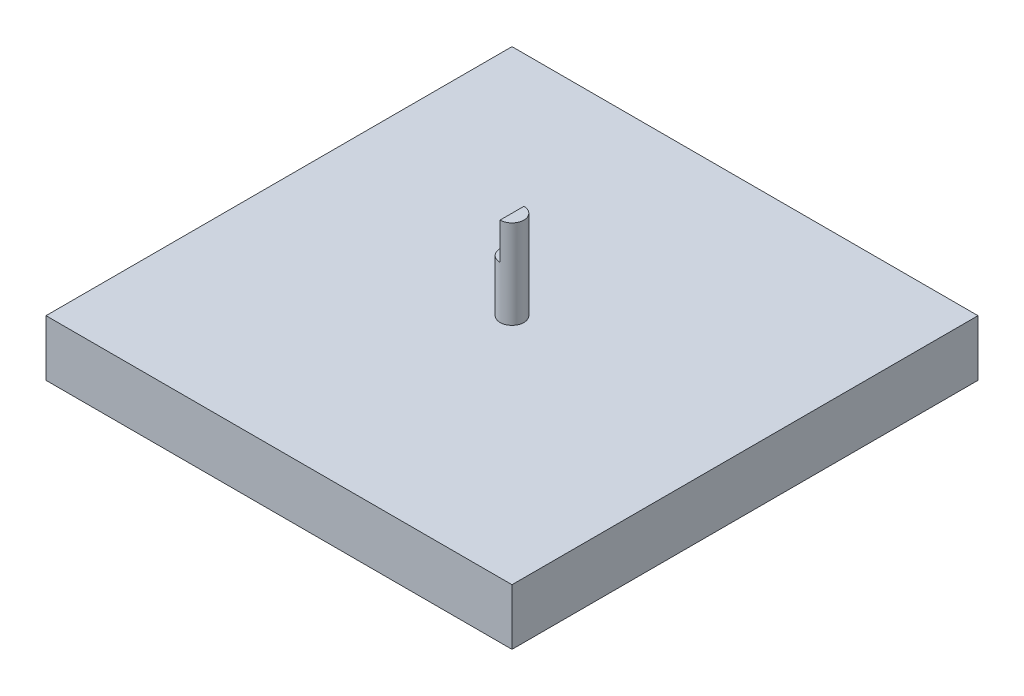
ISO-10303-21;
HEADER;
FILE_DESCRIPTION(('STEP AP214'),'2;1');
FILE_NAME('part.step','',(''),(''),'','','');
FILE_SCHEMA(('AUTOMOTIVE_DESIGN { 1 0 10303 214 1 1 1 1 }'));
ENDSEC;
DATA;
#1=APPLICATION_CONTEXT('core data for automotive mechanical design processes');
#2=APPLICATION_PROTOCOL_DEFINITION('international standard','automotive_design',2000,#1);
#3=PRODUCT_CONTEXT('',#1,'mechanical');
#4=PRODUCT('Part','Part','',(#3));
#5=PRODUCT_RELATED_PRODUCT_CATEGORY('part','',(#4));
#6=PRODUCT_DEFINITION_FORMATION('','',#4);
#7=PRODUCT_DEFINITION_CONTEXT('part definition',#1,'design');
#8=PRODUCT_DEFINITION('design','',#6,#7);
#9=PRODUCT_DEFINITION_SHAPE('','',#8);
#10=(LENGTH_UNIT() NAMED_UNIT(*) SI_UNIT(.MILLI.,.METRE.));
#11=(NAMED_UNIT(*) PLANE_ANGLE_UNIT() SI_UNIT($,.RADIAN.));
#12=(NAMED_UNIT(*) SI_UNIT($,.STERADIAN.) SOLID_ANGLE_UNIT());
#13=UNCERTAINTY_MEASURE_WITH_UNIT(LENGTH_MEASURE(1.E-05),#10,'distance_accuracy_value','');
#14=(GEOMETRIC_REPRESENTATION_CONTEXT(3) GLOBAL_UNCERTAINTY_ASSIGNED_CONTEXT((#13)) GLOBAL_UNIT_ASSIGNED_CONTEXT((#10,
#11,#12)) REPRESENTATION_CONTEXT('',''));
#15=CARTESIAN_POINT('',(0.,0.,0.));
#16=DIRECTION('',(0.,0.,1.));
#17=DIRECTION('',(1.,0.,0.));
#18=AXIS2_PLACEMENT_3D('',#15,#16,#17);
#19=CARTESIAN_POINT('',(0.,11.3,0.));
#20=DIRECTION('',(1.,0.,0.));
#21=DIRECTION('',(0.,0.,-1.));
#22=AXIS2_PLACEMENT_3D('',#19,#20,#21);
#23=PLANE('',#22);
#24=DIRECTION('',(0.,0.,1.));
#25=VECTOR('',#24,1.);
#26=CARTESIAN_POINT('',(0.,0.,0.));
#27=LINE('',#26,#25);
#28=CARTESIAN_POINT('',(0.,0.,-94.));
#29=VERTEX_POINT('',#28);
#30=CARTESIAN_POINT('',(0.,0.,0.));
#31=VERTEX_POINT('',#30);
#32=EDGE_CURVE('E157',#29,#31,#27,.T.);
#33=ORIENTED_EDGE('',*,*,#32,.T.);
#34=DIRECTION('',(0.,-1.,0.));
#35=VECTOR('',#34,1.);
#36=CARTESIAN_POINT('',(0.,11.3,0.));
#37=LINE('',#36,#35);
#38=CARTESIAN_POINT('',(0.,11.3,0.));
#39=VERTEX_POINT('',#38);
#40=EDGE_CURVE('E192',#39,#31,#37,.T.);
#41=ORIENTED_EDGE('',*,*,#40,.F.);
#42=DIRECTION('',(0.,0.,1.));
#43=VECTOR('',#42,1.);
#44=CARTESIAN_POINT('',(0.,11.3,0.));
#45=LINE('',#44,#43);
#46=CARTESIAN_POINT('',(0.,11.3,-94.));
#47=VERTEX_POINT('',#46);
#48=EDGE_CURVE('E161',#47,#39,#45,.T.);
#49=ORIENTED_EDGE('',*,*,#48,.F.);
#50=DIRECTION('',(0.,-1.,0.));
#51=VECTOR('',#50,1.);
#52=CARTESIAN_POINT('',(0.,11.3,-94.));
#53=LINE('',#52,#51);
#54=EDGE_CURVE('E171',#47,#29,#53,.T.);
#55=ORIENTED_EDGE('',*,*,#54,.T.);
#56=EDGE_LOOP('',(#33,#41,#49,#55));
#57=FACE_BOUND('',#56,.T.);
#58=ADVANCED_FACE('F45',(#57),#23,.F.);
#59=CARTESIAN_POINT('',(0.,11.3,0.));
#60=DIRECTION('',(0.,0.,-1.));
#61=DIRECTION('',(-1.,0.,0.));
#62=AXIS2_PLACEMENT_3D('',#59,#60,#61);
#63=PLANE('',#62);
#64=DIRECTION('',(1.,0.,0.));
#65=VECTOR('',#64,1.);
#66=CARTESIAN_POINT('',(0.,0.,0.));
#67=LINE('',#66,#65);
#68=CARTESIAN_POINT('',(94.,0.,0.));
#69=VERTEX_POINT('',#68);
#70=EDGE_CURVE('E175',#31,#69,#67,.T.);
#71=ORIENTED_EDGE('',*,*,#70,.T.);
#72=DIRECTION('',(0.,-1.,0.));
#73=VECTOR('',#72,1.);
#74=CARTESIAN_POINT('',(94.,11.3,0.));
#75=LINE('',#74,#73);
#76=CARTESIAN_POINT('',(94.,11.3,0.));
#77=VERTEX_POINT('',#76);
#78=EDGE_CURVE('E188',#77,#69,#75,.T.);
#79=ORIENTED_EDGE('',*,*,#78,.F.);
#80=DIRECTION('',(1.,0.,0.));
#81=VECTOR('',#80,1.);
#82=CARTESIAN_POINT('',(0.,11.3,0.));
#83=LINE('',#82,#81);
#84=EDGE_CURVE('E98',#39,#77,#83,.T.);
#85=ORIENTED_EDGE('',*,*,#84,.F.);
#86=ORIENTED_EDGE('',*,*,#40,.T.);
#87=EDGE_LOOP('',(#71,#79,#85,#86));
#88=FACE_BOUND('',#87,.T.);
#89=ADVANCED_FACE('F210',(#88),#63,.F.);
#90=CARTESIAN_POINT('',(94.,11.3,0.));
#91=DIRECTION('',(-1.,0.,0.));
#92=DIRECTION('',(0.,0.,1.));
#93=AXIS2_PLACEMENT_3D('',#90,#91,#92);
#94=PLANE('',#93);
#95=DIRECTION('',(0.,0.,-1.));
#96=VECTOR('',#95,1.);
#97=CARTESIAN_POINT('',(94.,0.,0.));
#98=LINE('',#97,#96);
#99=CARTESIAN_POINT('',(94.,0.,-94.));
#100=VERTEX_POINT('',#99);
#101=EDGE_CURVE('E178',#69,#100,#98,.T.);
#102=ORIENTED_EDGE('',*,*,#101,.T.);
#103=DIRECTION('',(0.,-1.,0.));
#104=VECTOR('',#103,1.);
#105=CARTESIAN_POINT('',(94.,11.3,-94.));
#106=LINE('',#105,#104);
#107=CARTESIAN_POINT('',(94.,11.3,-94.));
#108=VERTEX_POINT('',#107);
#109=EDGE_CURVE('E185',#108,#100,#106,.T.);
#110=ORIENTED_EDGE('',*,*,#109,.F.);
#111=DIRECTION('',(0.,0.,-1.));
#112=VECTOR('',#111,1.);
#113=CARTESIAN_POINT('',(94.,11.3,0.));
#114=LINE('',#113,#112);
#115=EDGE_CURVE('E166',#77,#108,#114,.T.);
#116=ORIENTED_EDGE('',*,*,#115,.F.);
#117=ORIENTED_EDGE('',*,*,#78,.T.);
#118=EDGE_LOOP('',(#102,#110,#116,#117));
#119=FACE_BOUND('',#118,.T.);
#120=ADVANCED_FACE('F215',(#119),#94,.F.);
#121=CARTESIAN_POINT('',(0.,11.3,-94.));
#122=DIRECTION('',(0.,0.,1.));
#123=DIRECTION('',(1.,0.,0.));
#124=AXIS2_PLACEMENT_3D('',#121,#122,#123);
#125=PLANE('',#124);
#126=DIRECTION('',(-1.,0.,0.));
#127=VECTOR('',#126,1.);
#128=CARTESIAN_POINT('',(0.,0.,-94.));
#129=LINE('',#128,#127);
#130=EDGE_CURVE('E90',#100,#29,#129,.T.);
#131=ORIENTED_EDGE('',*,*,#130,.T.);
#132=ORIENTED_EDGE('',*,*,#54,.F.);
#133=DIRECTION('',(-1.,0.,0.));
#134=VECTOR('',#133,1.);
#135=CARTESIAN_POINT('',(0.,11.3,-94.));
#136=LINE('',#135,#134);
#137=EDGE_CURVE('E69',#108,#47,#136,.T.);
#138=ORIENTED_EDGE('',*,*,#137,.F.);
#139=ORIENTED_EDGE('',*,*,#109,.T.);
#140=EDGE_LOOP('',(#131,#132,#138,#139));
#141=FACE_BOUND('',#140,.T.);
#142=ADVANCED_FACE('F204',(#141),#125,.F.);
#143=CARTESIAN_POINT('',(0.,11.3,0.));
#144=DIRECTION('',(0.,-1.,0.));
#145=DIRECTION('',(0.,0.,-1.));
#146=AXIS2_PLACEMENT_3D('',#143,#144,#145);
#147=PLANE('',#146);
#148=CARTESIAN_POINT('',(47.,11.3,-47.));
#149=DIRECTION('',(0.,-1.,0.));
#150=DIRECTION('',(0.,0.,-1.));
#151=AXIS2_PLACEMENT_3D('',#148,#149,#150);
#152=CIRCLE('',#151,2.4);
#153=CARTESIAN_POINT('',(47.,11.3,-49.4));
#154=VERTEX_POINT('',#153);
#155=EDGE_CURVE('E195',#154,#154,#152,.F.);
#156=ORIENTED_EDGE('',*,*,#155,.F.);
#157=EDGE_LOOP('',(#156));
#158=FACE_BOUND('',#157,.T.);
#159=ORIENTED_EDGE('',*,*,#48,.T.);
#160=ORIENTED_EDGE('',*,*,#84,.T.);
#161=ORIENTED_EDGE('',*,*,#115,.T.);
#162=ORIENTED_EDGE('',*,*,#137,.T.);
#163=EDGE_LOOP('',(#159,#160,#161,#162));
#164=FACE_BOUND('',#163,.T.);
#165=ADVANCED_FACE('F201',(#158,#164),#147,.F.);
#166=CARTESIAN_POINT('',(0.,0.,0.));
#167=DIRECTION('',(0.,-1.,0.));
#168=DIRECTION('',(0.,0.,-1.));
#169=AXIS2_PLACEMENT_3D('',#166,#167,#168);
#170=PLANE('',#169);
#171=CARTESIAN_POINT('',(87.6,0.,-6.40000000000003));
#172=DIRECTION('',(0.,-1.,0.));
#173=DIRECTION('',(0.,0.,1.));
#174=AXIS2_PLACEMENT_3D('',#171,#172,#173);
#175=CIRCLE('',#174,1.89999999999999);
#176=CARTESIAN_POINT('',(87.6,0.,-4.50000000000004));
#177=VERTEX_POINT('',#176);
#178=EDGE_CURVE('E129',#177,#177,#175,.T.);
#179=ORIENTED_EDGE('',*,*,#178,.F.);
#180=EDGE_LOOP('',(#179));
#181=FACE_BOUND('',#180,.T.);
#182=CARTESIAN_POINT('',(87.6,0.,-87.6));
#183=DIRECTION('',(0.,-1.,0.));
#184=DIRECTION('',(0.,0.,-1.));
#185=AXIS2_PLACEMENT_3D('',#182,#183,#184);
#186=CIRCLE('',#185,1.89999999999999);
#187=CARTESIAN_POINT('',(87.6,0.,-89.5));
#188=VERTEX_POINT('',#187);
#189=EDGE_CURVE('E137',#188,#188,#186,.T.);
#190=ORIENTED_EDGE('',*,*,#189,.F.);
#191=EDGE_LOOP('',(#190));
#192=FACE_BOUND('',#191,.T.);
#193=CARTESIAN_POINT('',(6.39999999999997,0.,-87.6));
#194=DIRECTION('',(0.,-1.,0.));
#195=DIRECTION('',(0.,0.,1.));
#196=AXIS2_PLACEMENT_3D('',#193,#194,#195);
#197=CIRCLE('',#196,1.9);
#198=CARTESIAN_POINT('',(6.39999999999997,0.,-85.7));
#199=VERTEX_POINT('',#198);
#200=EDGE_CURVE('E145',#199,#199,#197,.T.);
#201=ORIENTED_EDGE('',*,*,#200,.F.);
#202=EDGE_LOOP('',(#201));
#203=FACE_BOUND('',#202,.T.);
#204=CARTESIAN_POINT('',(6.39999999999997,0.,-6.4));
#205=DIRECTION('',(0.,-1.,0.));
#206=DIRECTION('',(0.,0.,-1.));
#207=AXIS2_PLACEMENT_3D('',#204,#205,#206);
#208=CIRCLE('',#207,1.9);
#209=CARTESIAN_POINT('',(6.39999999999997,0.,-8.3));
#210=VERTEX_POINT('',#209);
#211=EDGE_CURVE('E149',#210,#210,#208,.T.);
#212=ORIENTED_EDGE('',*,*,#211,.F.);
#213=EDGE_LOOP('',(#212));
#214=FACE_BOUND('',#213,.T.);
#215=ORIENTED_EDGE('',*,*,#32,.F.);
#216=ORIENTED_EDGE('',*,*,#130,.F.);
#217=ORIENTED_EDGE('',*,*,#101,.F.);
#218=ORIENTED_EDGE('',*,*,#70,.F.);
#219=EDGE_LOOP('',(#215,#216,#217,#218));
#220=FACE_BOUND('',#219,.T.);
#221=ADVANCED_FACE('F203',(#181,#192,#203,#214,#220),#170,.T.);
#222=CARTESIAN_POINT('',(6.39999999999997,-2.,-6.4));
#223=DIRECTION('',(0.,1.,0.));
#224=DIRECTION('',(0.,0.,1.));
#225=AXIS2_PLACEMENT_3D('',#222,#223,#224);
#226=CYLINDRICAL_SURFACE('',#225,1.9);
#227=CARTESIAN_POINT('',(6.39999999999997,-2.,-6.4));
#228=DIRECTION('',(0.,-1.,0.));
#229=DIRECTION('',(0.,0.,-1.));
#230=AXIS2_PLACEMENT_3D('',#227,#228,#229);
#231=CIRCLE('',#230,1.9);
#232=CARTESIAN_POINT('',(6.39999999999997,-2.,-8.3));
#233=VERTEX_POINT('',#232);
#234=EDGE_CURVE('E153',#233,#233,#231,.T.);
#235=ORIENTED_EDGE('',*,*,#234,.F.);
#236=EDGE_LOOP('',(#235));
#237=FACE_BOUND('',#236,.T.);
#238=ORIENTED_EDGE('',*,*,#211,.T.);
#239=EDGE_LOOP('',(#238));
#240=FACE_BOUND('',#239,.T.);
#241=ADVANCED_FACE('F218',(#237,#240),#226,.T.);
#242=CARTESIAN_POINT('',(6.39999999999997,-2.,-6.4));
#243=DIRECTION('',(0.,-1.,0.));
#244=DIRECTION('',(0.,0.,-1.));
#245=AXIS2_PLACEMENT_3D('',#242,#243,#244);
#246=PLANE('',#245);
#247=ORIENTED_EDGE('',*,*,#234,.T.);
#248=EDGE_LOOP('',(#247));
#249=FACE_BOUND('',#248,.T.);
#250=ADVANCED_FACE('F224',(#249),#246,.T.);
#251=CARTESIAN_POINT('',(6.39999999999997,-2.,-87.6));
#252=DIRECTION('',(0.,1.,0.));
#253=DIRECTION('',(0.,0.,1.));
#254=AXIS2_PLACEMENT_3D('',#251,#252,#253);
#255=CYLINDRICAL_SURFACE('',#254,1.9);
#256=CARTESIAN_POINT('',(6.39999999999997,-2.,-87.6));
#257=DIRECTION('',(0.,-1.,0.));
#258=DIRECTION('',(0.,0.,1.));
#259=AXIS2_PLACEMENT_3D('',#256,#257,#258);
#260=CIRCLE('',#259,1.9);
#261=CARTESIAN_POINT('',(6.39999999999997,-2.,-85.7));
#262=VERTEX_POINT('',#261);
#263=EDGE_CURVE('E141',#262,#262,#260,.T.);
#264=ORIENTED_EDGE('',*,*,#263,.F.);
#265=EDGE_LOOP('',(#264));
#266=FACE_BOUND('',#265,.T.);
#267=ORIENTED_EDGE('',*,*,#200,.T.);
#268=EDGE_LOOP('',(#267));
#269=FACE_BOUND('',#268,.T.);
#270=ADVANCED_FACE('F268',(#266,#269),#255,.T.);
#271=CARTESIAN_POINT('',(6.39999999999997,-2.,-87.6));
#272=DIRECTION('',(0.,1.,0.));
#273=DIRECTION('',(0.,0.,1.));
#274=AXIS2_PLACEMENT_3D('',#271,#272,#273);
#275=PLANE('',#274);
#276=ORIENTED_EDGE('',*,*,#263,.T.);
#277=EDGE_LOOP('',(#276));
#278=FACE_BOUND('',#277,.T.);
#279=ADVANCED_FACE('F278',(#278),#275,.F.);
#280=CARTESIAN_POINT('',(87.6,-2.,-87.6));
#281=DIRECTION('',(0.,1.,0.));
#282=DIRECTION('',(0.,0.,1.));
#283=AXIS2_PLACEMENT_3D('',#280,#281,#282);
#284=CYLINDRICAL_SURFACE('',#283,1.89999999999999);
#285=CARTESIAN_POINT('',(87.6,-2.,-87.6));
#286=DIRECTION('',(0.,-1.,0.));
#287=DIRECTION('',(0.,0.,-1.));
#288=AXIS2_PLACEMENT_3D('',#285,#286,#287);
#289=CIRCLE('',#288,1.89999999999999);
#290=CARTESIAN_POINT('',(87.6,-2.,-89.5));
#291=VERTEX_POINT('',#290);
#292=EDGE_CURVE('E133',#291,#291,#289,.T.);
#293=ORIENTED_EDGE('',*,*,#292,.F.);
#294=EDGE_LOOP('',(#293));
#295=FACE_BOUND('',#294,.T.);
#296=ORIENTED_EDGE('',*,*,#189,.T.);
#297=EDGE_LOOP('',(#296));
#298=FACE_BOUND('',#297,.T.);
#299=ADVANCED_FACE('F288',(#295,#298),#284,.T.);
#300=CARTESIAN_POINT('',(87.6,-2.,-87.6));
#301=DIRECTION('',(0.,-1.,0.));
#302=DIRECTION('',(0.,0.,-1.));
#303=AXIS2_PLACEMENT_3D('',#300,#301,#302);
#304=PLANE('',#303);
#305=ORIENTED_EDGE('',*,*,#292,.T.);
#306=EDGE_LOOP('',(#305));
#307=FACE_BOUND('',#306,.T.);
#308=ADVANCED_FACE('F298',(#307),#304,.T.);
#309=CARTESIAN_POINT('',(87.6,-2.,-6.40000000000003));
#310=DIRECTION('',(0.,1.,0.));
#311=DIRECTION('',(0.,0.,1.));
#312=AXIS2_PLACEMENT_3D('',#309,#310,#311);
#313=CYLINDRICAL_SURFACE('',#312,1.89999999999999);
#314=CARTESIAN_POINT('',(87.6,-2.,-6.40000000000003));
#315=DIRECTION('',(0.,-1.,0.));
#316=DIRECTION('',(0.,0.,1.));
#317=AXIS2_PLACEMENT_3D('',#314,#315,#316);
#318=CIRCLE('',#317,1.89999999999999);
#319=CARTESIAN_POINT('',(87.6,-2.,-4.50000000000004));
#320=VERTEX_POINT('',#319);
#321=EDGE_CURVE('E126',#320,#320,#318,.T.);
#322=ORIENTED_EDGE('',*,*,#321,.F.);
#323=EDGE_LOOP('',(#322));
#324=FACE_BOUND('',#323,.T.);
#325=ORIENTED_EDGE('',*,*,#178,.T.);
#326=EDGE_LOOP('',(#325));
#327=FACE_BOUND('',#326,.T.);
#328=ADVANCED_FACE('F308',(#324,#327),#313,.T.);
#329=CARTESIAN_POINT('',(87.6,-2.,-6.40000000000003));
#330=DIRECTION('',(0.,1.,0.));
#331=DIRECTION('',(0.,0.,1.));
#332=AXIS2_PLACEMENT_3D('',#329,#330,#331);
#333=PLANE('',#332);
#334=ORIENTED_EDGE('',*,*,#321,.T.);
#335=EDGE_LOOP('',(#334));
#336=FACE_BOUND('',#335,.T.);
#337=ADVANCED_FACE('F318',(#336),#333,.F.);
#338=CARTESIAN_POINT('',(47.,29.2,-47.));
#339=DIRECTION('',(0.,-1.,0.));
#340=DIRECTION('',(0.,0.,-1.));
#341=AXIS2_PLACEMENT_3D('',#338,#339,#340);
#342=CYLINDRICAL_SURFACE('',#341,2.4);
#343=CARTESIAN_POINT('',(47.,29.2,-47.));
#344=DIRECTION('',(0.,1.,0.));
#345=DIRECTION('',(0.,0.,1.));
#346=AXIS2_PLACEMENT_3D('',#343,#344,#345);
#347=CIRCLE('',#346,2.4);
#348=CARTESIAN_POINT('',(47.,29.2,-44.6));
#349=VERTEX_POINT('',#348);
#350=CARTESIAN_POINT('',(47.,29.2,-49.4));
#351=VERTEX_POINT('',#350);
#352=EDGE_CURVE('E122',#349,#351,#347,.T.);
#353=ORIENTED_EDGE('',*,*,#352,.F.);
#354=DIRECTION('',(0.,-1.,0.));
#355=VECTOR('',#354,1.);
#356=CARTESIAN_POINT('',(47.,29.2,-44.6));
#357=LINE('',#356,#355);
#358=CARTESIAN_POINT('',(47.,21.8,-44.6));
#359=VERTEX_POINT('',#358);
#360=EDGE_CURVE('E60',#349,#359,#357,.T.);
#361=ORIENTED_EDGE('',*,*,#360,.T.);
#362=CARTESIAN_POINT('',(47.,21.8,-47.));
#363=DIRECTION('',(0.,-1.,0.));
#364=DIRECTION('',(0.,0.,-1.));
#365=AXIS2_PLACEMENT_3D('',#362,#363,#364);
#366=CIRCLE('',#365,2.4);
#367=CARTESIAN_POINT('',(47.,21.8,-49.4));
#368=VERTEX_POINT('',#367);
#369=EDGE_CURVE('E11',#359,#368,#366,.T.);
#370=ORIENTED_EDGE('',*,*,#369,.T.);
#371=DIRECTION('',(0.,1.,0.));
#372=VECTOR('',#371,1.);
#373=CARTESIAN_POINT('',(47.,21.8,-49.4));
#374=LINE('',#373,#372);
#375=EDGE_CURVE('E111',#368,#351,#374,.T.);
#376=ORIENTED_EDGE('',*,*,#375,.T.);
#377=EDGE_LOOP('',(#353,#361,#370,#376));
#378=FACE_BOUND('',#377,.T.);
#379=ORIENTED_EDGE('',*,*,#155,.T.);
#380=EDGE_LOOP('',(#379));
#381=FACE_BOUND('',#380,.T.);
#382=ADVANCED_FACE('F120',(#378,#381),#342,.T.);
#383=CARTESIAN_POINT('',(47.,29.2,-47.));
#384=DIRECTION('',(0.,1.,0.));
#385=DIRECTION('',(0.,0.,1.));
#386=AXIS2_PLACEMENT_3D('',#383,#384,#385);
#387=PLANE('',#386);
#388=DIRECTION('',(0.,0.,-1.));
#389=VECTOR('',#388,1.);
#390=CARTESIAN_POINT('',(47.,29.2,-47.));
#391=LINE('',#390,#389);
#392=EDGE_CURVE('E53',#349,#351,#391,.T.);
#393=ORIENTED_EDGE('',*,*,#392,.F.);
#394=ORIENTED_EDGE('',*,*,#352,.T.);
#395=EDGE_LOOP('',(#393,#394));
#396=FACE_BOUND('',#395,.T.);
#397=ADVANCED_FACE('F335',(#396),#387,.T.);
#398=CARTESIAN_POINT('',(0.,21.8,0.));
#399=DIRECTION('',(0.,-1.,0.));
#400=DIRECTION('',(0.,0.,-1.));
#401=AXIS2_PLACEMENT_3D('',#398,#399,#400);
#402=PLANE('',#401);
#403=DIRECTION('',(0.,0.,-1.));
#404=VECTOR('',#403,1.);
#405=CARTESIAN_POINT('',(47.,21.8,-49.4));
#406=LINE('',#405,#404);
#407=EDGE_CURVE('E107',#359,#368,#406,.T.);
#408=ORIENTED_EDGE('',*,*,#407,.T.);
#409=ORIENTED_EDGE('',*,*,#369,.F.);
#410=EDGE_LOOP('',(#408,#409));
#411=FACE_BOUND('',#410,.T.);
#412=ADVANCED_FACE('F109',(#411),#402,.F.);
#413=CARTESIAN_POINT('',(47.,21.8,-49.4));
#414=DIRECTION('',(1.,0.,0.));
#415=DIRECTION('',(0.,0.,-1.));
#416=AXIS2_PLACEMENT_3D('',#413,#414,#415);
#417=PLANE('',#416);
#418=ORIENTED_EDGE('',*,*,#392,.T.);
#419=ORIENTED_EDGE('',*,*,#375,.F.);
#420=ORIENTED_EDGE('',*,*,#407,.F.);
#421=ORIENTED_EDGE('',*,*,#360,.F.);
#422=EDGE_LOOP('',(#418,#419,#420,#421));
#423=FACE_BOUND('',#422,.T.);
#424=ADVANCED_FACE('F114',(#423),#417,.F.);
#425=CLOSED_SHELL('',(#58,#89,#120,#142,#165,#221,#241,#250,#270,#279,#299,#308,#328,#337,#382,
#397,#412,#424));
#426=MANIFOLD_SOLID_BREP('B2',#425);
#427=ADVANCED_BREP_SHAPE_REPRESENTATION('',(#18,#426),#14);
#428=SHAPE_DEFINITION_REPRESENTATION(#9,#427);
ENDSEC;
END-ISO-10303-21;
